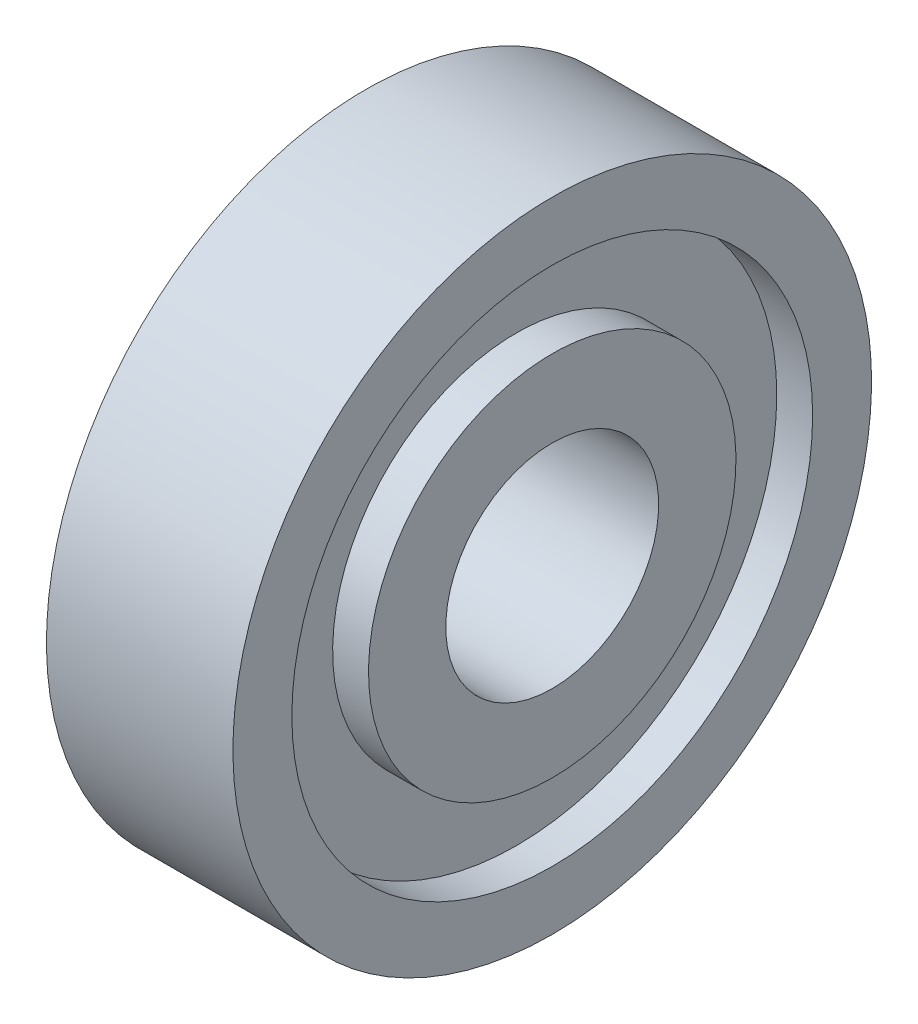
ISO-10303-21;
HEADER;
FILE_DESCRIPTION(('STEP AP214'),'2;1');
FILE_NAME('part.step','',(''),(''),'','','');
FILE_SCHEMA(('AUTOMOTIVE_DESIGN { 1 0 10303 214 1 1 1 1 }'));
ENDSEC;
DATA;
#1=APPLICATION_CONTEXT('core data for automotive mechanical design processes');
#2=APPLICATION_PROTOCOL_DEFINITION('international standard','automotive_design',2000,#1);
#3=PRODUCT_CONTEXT('',#1,'mechanical');
#4=PRODUCT('Part','Part','',(#3));
#5=PRODUCT_RELATED_PRODUCT_CATEGORY('part','',(#4));
#6=PRODUCT_DEFINITION_FORMATION('','',#4);
#7=PRODUCT_DEFINITION_CONTEXT('part definition',#1,'design');
#8=PRODUCT_DEFINITION('design','',#6,#7);
#9=PRODUCT_DEFINITION_SHAPE('','',#8);
#10=(LENGTH_UNIT() NAMED_UNIT(*) SI_UNIT(.MILLI.,.METRE.));
#11=(NAMED_UNIT(*) PLANE_ANGLE_UNIT() SI_UNIT($,.RADIAN.));
#12=(NAMED_UNIT(*) SI_UNIT($,.STERADIAN.) SOLID_ANGLE_UNIT());
#13=UNCERTAINTY_MEASURE_WITH_UNIT(LENGTH_MEASURE(1.E-05),#10,'distance_accuracy_value','');
#14=(GEOMETRIC_REPRESENTATION_CONTEXT(3) GLOBAL_UNCERTAINTY_ASSIGNED_CONTEXT((#13)) GLOBAL_UNIT_ASSIGNED_CONTEXT((#10,
#11,#12)) REPRESENTATION_CONTEXT('',''));
#15=CARTESIAN_POINT('',(0.,0.,0.));
#16=DIRECTION('',(0.,0.,1.));
#17=DIRECTION('',(1.,0.,0.));
#18=AXIS2_PLACEMENT_3D('',#15,#16,#17);
#19=CARTESIAN_POINT('',(0.,3.67761376907083E-13,0.));
#20=DIRECTION('',(-1.,0.,0.));
#21=DIRECTION('',(0.,-1.,0.));
#22=AXIS2_PLACEMENT_3D('',#19,#20,#21);
#23=CYLINDRICAL_SURFACE('',#22,3.175);
#24=CARTESIAN_POINT('',(5.5626,3.67761376907083E-13,0.));
#25=DIRECTION('',(-1.,0.,0.));
#26=DIRECTION('',(0.,-1.,0.));
#27=AXIS2_PLACEMENT_3D('',#24,#25,#26);
#28=CIRCLE('',#27,3.175);
#29=CARTESIAN_POINT('',(5.5626,-3.17499999999963,0.));
#30=VERTEX_POINT('',#29);
#31=EDGE_CURVE('E17',#30,#30,#28,.F.);
#32=ORIENTED_EDGE('',*,*,#31,.T.);
#33=EDGE_LOOP('',(#32));
#34=FACE_BOUND('',#33,.T.);
#35=CARTESIAN_POINT('',(0.,3.67761376907083E-13,0.));
#36=DIRECTION('',(-1.,0.,0.));
#37=DIRECTION('',(0.,-1.,0.));
#38=AXIS2_PLACEMENT_3D('',#35,#36,#37);
#39=CIRCLE('',#38,3.175);
#40=CARTESIAN_POINT('',(0.,-3.17499999999963,0.));
#41=VERTEX_POINT('',#40);
#42=EDGE_CURVE('E51',#41,#41,#39,.T.);
#43=ORIENTED_EDGE('',*,*,#42,.T.);
#44=EDGE_LOOP('',(#43));
#45=FACE_BOUND('',#44,.T.);
#46=ADVANCED_FACE('F14',(#34,#45),#23,.F.);
#47=CARTESIAN_POINT('',(5.56260000000016,5.48068703417216,0.));
#48=DIRECTION('',(-1.,0.,0.));
#49=DIRECTION('',(0.,-1.,0.));
#50=AXIS2_PLACEMENT_3D('',#47,#48,#49);
#51=PLANE('',#50);
#52=ORIENTED_EDGE('',*,*,#31,.F.);
#53=EDGE_LOOP('',(#52));
#54=FACE_BOUND('',#53,.T.);
#55=CARTESIAN_POINT('',(5.56259999999999,3.67761376907083E-13,0.));
#56=DIRECTION('',(-1.,0.,0.));
#57=DIRECTION('',(0.,-1.,0.));
#58=AXIS2_PLACEMENT_3D('',#55,#56,#57);
#59=CIRCLE('',#58,5.48068703417194);
#60=CARTESIAN_POINT('',(5.56259999999999,-5.48068703417157,0.));
#61=VERTEX_POINT('',#60);
#62=EDGE_CURVE('E49',#61,#61,#59,.T.);
#63=ORIENTED_EDGE('',*,*,#62,.F.);
#64=EDGE_LOOP('',(#63));
#65=FACE_BOUND('',#64,.T.);
#66=ADVANCED_FACE('F59',(#54,#65),#51,.F.);
#67=CARTESIAN_POINT('',(1.66533453693773E-13,3.17500000000003,0.));
#68=DIRECTION('',(1.,0.,0.));
#69=DIRECTION('',(0.,1.,0.));
#70=AXIS2_PLACEMENT_3D('',#67,#68,#69);
#71=PLANE('',#70);
#72=CARTESIAN_POINT('',(0.,3.67761376907083E-13,0.));
#73=DIRECTION('',(-1.,0.,0.));
#74=DIRECTION('',(0.,-1.,0.));
#75=AXIS2_PLACEMENT_3D('',#72,#73,#74);
#76=CIRCLE('',#75,5.48068703417195);
#77=CARTESIAN_POINT('',(0.,-5.48068703417158,0.));
#78=VERTEX_POINT('',#77);
#79=EDGE_CURVE('E46',#78,#78,#76,.F.);
#80=ORIENTED_EDGE('',*,*,#79,.F.);
#81=EDGE_LOOP('',(#80));
#82=FACE_BOUND('',#81,.T.);
#83=ORIENTED_EDGE('',*,*,#42,.F.);
#84=EDGE_LOOP('',(#83));
#85=FACE_BOUND('',#84,.T.);
#86=ADVANCED_FACE('F62',(#82,#85),#71,.F.);
#87=CARTESIAN_POINT('',(0.,3.67761376907083E-13,0.));
#88=DIRECTION('',(-1.,0.,0.));
#89=DIRECTION('',(0.,-1.,0.));
#90=AXIS2_PLACEMENT_3D('',#87,#88,#89);
#91=CYLINDRICAL_SURFACE('',#90,5.48068703417194);
#92=CARTESIAN_POINT('',(4.49270724332515,3.67761376907083E-13,0.));
#93=DIRECTION('',(-1.,0.,0.));
#94=DIRECTION('',(0.,-1.,0.));
#95=AXIS2_PLACEMENT_3D('',#92,#93,#94);
#96=CIRCLE('',#95,5.48068703417194);
#97=CARTESIAN_POINT('',(4.49270724332515,-5.48068703417157,0.));
#98=VERTEX_POINT('',#97);
#99=EDGE_CURVE('E43',#98,#98,#96,.F.);
#100=ORIENTED_EDGE('',*,*,#99,.T.);
#101=EDGE_LOOP('',(#100));
#102=FACE_BOUND('',#101,.T.);
#103=ORIENTED_EDGE('',*,*,#62,.T.);
#104=EDGE_LOOP('',(#103));
#105=FACE_BOUND('',#104,.T.);
#106=ADVANCED_FACE('F65',(#102,#105),#91,.T.);
#107=CARTESIAN_POINT('',(0.,3.67761376907083E-13,0.));
#108=DIRECTION('',(-1.,0.,0.));
#109=DIRECTION('',(0.,-1.,0.));
#110=AXIS2_PLACEMENT_3D('',#107,#108,#109);
#111=CYLINDRICAL_SURFACE('',#110,5.48068703417195);
#112=ORIENTED_EDGE('',*,*,#79,.T.);
#113=EDGE_LOOP('',(#112));
#114=FACE_BOUND('',#113,.T.);
#115=CARTESIAN_POINT('',(1.15552381380363,3.67761376907083E-13,0.));
#116=DIRECTION('',(-1.,0.,0.));
#117=DIRECTION('',(0.,-1.,0.));
#118=AXIS2_PLACEMENT_3D('',#115,#116,#117);
#119=CIRCLE('',#118,5.48068703417195);
#120=CARTESIAN_POINT('',(1.15552381380363,-5.48068703417158,0.));
#121=VERTEX_POINT('',#120);
#122=EDGE_CURVE('E40',#121,#121,#119,.T.);
#123=ORIENTED_EDGE('',*,*,#122,.T.);
#124=EDGE_LOOP('',(#123));
#125=FACE_BOUND('',#124,.T.);
#126=ADVANCED_FACE('F67',(#114,#125),#111,.T.);
#127=CARTESIAN_POINT('',(4.49270724332512,7.7672756803257,1.2490009027033E-13));
#128=DIRECTION('',(-1.,0.,0.));
#129=DIRECTION('',(0.,-1.,0.));
#130=AXIS2_PLACEMENT_3D('',#127,#128,#129);
#131=PLANE('',#130);
#132=ORIENTED_EDGE('',*,*,#99,.F.);
#133=EDGE_LOOP('',(#132));
#134=FACE_BOUND('',#133,.T.);
#135=CARTESIAN_POINT('',(4.49270724332513,3.67761376907083E-13,0.));
#136=DIRECTION('',(-1.,0.,0.));
#137=DIRECTION('',(0.,-1.,0.));
#138=AXIS2_PLACEMENT_3D('',#135,#136,#137);
#139=CIRCLE('',#138,7.76727568032563);
#140=CARTESIAN_POINT('',(4.49270724332513,-7.76727568032526,0.));
#141=VERTEX_POINT('',#140);
#142=EDGE_CURVE('E37',#141,#141,#139,.F.);
#143=ORIENTED_EDGE('',*,*,#142,.T.);
#144=EDGE_LOOP('',(#143));
#145=FACE_BOUND('',#144,.T.);
#146=ADVANCED_FACE('F75',(#134,#145),#131,.F.);
#147=CARTESIAN_POINT('',(1.1555238138036,7.76727568032567,0.));
#148=DIRECTION('',(1.,0.,0.));
#149=DIRECTION('',(0.,1.,0.));
#150=AXIS2_PLACEMENT_3D('',#147,#148,#149);
#151=PLANE('',#150);
#152=CARTESIAN_POINT('',(1.15552381380359,3.67761376907083E-13,0.));
#153=DIRECTION('',(-1.,0.,0.));
#154=DIRECTION('',(0.,-1.,0.));
#155=AXIS2_PLACEMENT_3D('',#152,#153,#154);
#156=CIRCLE('',#155,7.76727568032561);
#157=CARTESIAN_POINT('',(1.15552381380359,-7.76727568032524,0.));
#158=VERTEX_POINT('',#157);
#159=EDGE_CURVE('E34',#158,#158,#156,.T.);
#160=ORIENTED_EDGE('',*,*,#159,.T.);
#161=EDGE_LOOP('',(#160));
#162=FACE_BOUND('',#161,.T.);
#163=ORIENTED_EDGE('',*,*,#122,.F.);
#164=EDGE_LOOP('',(#163));
#165=FACE_BOUND('',#164,.T.);
#166=ADVANCED_FACE('F102',(#162,#165),#151,.F.);
#167=CARTESIAN_POINT('',(0.,3.67761376907083E-13,0.));
#168=DIRECTION('',(-1.,0.,0.));
#169=DIRECTION('',(0.,-1.,0.));
#170=AXIS2_PLACEMENT_3D('',#167,#168,#169);
#171=CYLINDRICAL_SURFACE('',#170,7.76727568032563);
#172=CARTESIAN_POINT('',(5.56259999999999,3.67761376907083E-13,0.));
#173=DIRECTION('',(-1.,0.,0.));
#174=DIRECTION('',(0.,-1.,0.));
#175=AXIS2_PLACEMENT_3D('',#172,#173,#174);
#176=CIRCLE('',#175,7.76727568032563);
#177=CARTESIAN_POINT('',(5.56259999999999,-7.76727568032526,0.));
#178=VERTEX_POINT('',#177);
#179=EDGE_CURVE('E31',#178,#178,#176,.F.);
#180=ORIENTED_EDGE('',*,*,#179,.T.);
#181=EDGE_LOOP('',(#180));
#182=FACE_BOUND('',#181,.T.);
#183=ORIENTED_EDGE('',*,*,#142,.F.);
#184=EDGE_LOOP('',(#183));
#185=FACE_BOUND('',#184,.T.);
#186=ADVANCED_FACE('F98',(#182,#185),#171,.F.);
#187=CARTESIAN_POINT('',(0.,3.67761376907083E-13,0.));
#188=DIRECTION('',(-1.,0.,0.));
#189=DIRECTION('',(0.,-1.,0.));
#190=AXIS2_PLACEMENT_3D('',#187,#188,#189);
#191=CYLINDRICAL_SURFACE('',#190,7.76727568032561);
#192=ORIENTED_EDGE('',*,*,#159,.F.);
#193=EDGE_LOOP('',(#192));
#194=FACE_BOUND('',#193,.T.);
#195=CARTESIAN_POINT('',(0.,3.67761376907083E-13,0.));
#196=DIRECTION('',(-1.,0.,0.));
#197=DIRECTION('',(0.,-1.,0.));
#198=AXIS2_PLACEMENT_3D('',#195,#196,#197);
#199=CIRCLE('',#198,7.76727568032561);
#200=CARTESIAN_POINT('',(0.,-7.76727568032524,0.));
#201=VERTEX_POINT('',#200);
#202=EDGE_CURVE('E26',#201,#201,#199,.T.);
#203=ORIENTED_EDGE('',*,*,#202,.T.);
#204=EDGE_LOOP('',(#203));
#205=FACE_BOUND('',#204,.T.);
#206=ADVANCED_FACE('F94',(#194,#205),#191,.F.);
#207=CARTESIAN_POINT('',(5.56260000000019,9.52500000000001,0.));
#208=DIRECTION('',(-1.,0.,0.));
#209=DIRECTION('',(0.,-1.,0.));
#210=AXIS2_PLACEMENT_3D('',#207,#208,#209);
#211=PLANE('',#210);
#212=ORIENTED_EDGE('',*,*,#179,.F.);
#213=EDGE_LOOP('',(#212));
#214=FACE_BOUND('',#213,.T.);
#215=CARTESIAN_POINT('',(5.5626,3.67761376907083E-13,0.));
#216=DIRECTION('',(-1.,0.,0.));
#217=DIRECTION('',(0.,-1.,0.));
#218=AXIS2_PLACEMENT_3D('',#215,#216,#217);
#219=CIRCLE('',#218,9.525);
#220=CARTESIAN_POINT('',(5.5626,-9.52499999999963,0.));
#221=VERTEX_POINT('',#220);
#222=EDGE_CURVE('E21',#221,#221,#219,.T.);
#223=ORIENTED_EDGE('',*,*,#222,.F.);
#224=EDGE_LOOP('',(#223));
#225=FACE_BOUND('',#224,.T.);
#226=ADVANCED_FACE('F87',(#214,#225),#211,.F.);
#227=CARTESIAN_POINT('',(0.,7.76727568032514,0.));
#228=DIRECTION('',(1.,0.,0.));
#229=DIRECTION('',(0.,1.,0.));
#230=AXIS2_PLACEMENT_3D('',#227,#228,#229);
#231=PLANE('',#230);
#232=CARTESIAN_POINT('',(0.,3.67761376907083E-13,0.));
#233=DIRECTION('',(-1.,0.,0.));
#234=DIRECTION('',(0.,-1.,0.));
#235=AXIS2_PLACEMENT_3D('',#232,#233,#234);
#236=CIRCLE('',#235,9.525);
#237=CARTESIAN_POINT('',(0.,-9.52499999999963,0.));
#238=VERTEX_POINT('',#237);
#239=EDGE_CURVE('E10',#238,#238,#236,.F.);
#240=ORIENTED_EDGE('',*,*,#239,.F.);
#241=EDGE_LOOP('',(#240));
#242=FACE_BOUND('',#241,.T.);
#243=ORIENTED_EDGE('',*,*,#202,.F.);
#244=EDGE_LOOP('',(#243));
#245=FACE_BOUND('',#244,.T.);
#246=ADVANCED_FACE('F82',(#242,#245),#231,.F.);
#247=CARTESIAN_POINT('',(0.,3.67761376907083E-13,0.));
#248=DIRECTION('',(-1.,0.,0.));
#249=DIRECTION('',(0.,-1.,0.));
#250=AXIS2_PLACEMENT_3D('',#247,#248,#249);
#251=CYLINDRICAL_SURFACE('',#250,9.525);
#252=ORIENTED_EDGE('',*,*,#239,.T.);
#253=EDGE_LOOP('',(#252));
#254=FACE_BOUND('',#253,.T.);
#255=ORIENTED_EDGE('',*,*,#222,.T.);
#256=EDGE_LOOP('',(#255));
#257=FACE_BOUND('',#256,.T.);
#258=ADVANCED_FACE('F80',(#254,#257),#251,.T.);
#259=CLOSED_SHELL('',(#46,#66,#86,#106,#126,#146,#166,#186,#206,#226,#246,#258));
#260=MANIFOLD_SOLID_BREP('B1',#259);
#261=ADVANCED_BREP_SHAPE_REPRESENTATION('',(#18,#260),#14);
#262=SHAPE_DEFINITION_REPRESENTATION(#9,#261);
ENDSEC;
END-ISO-10303-21;
